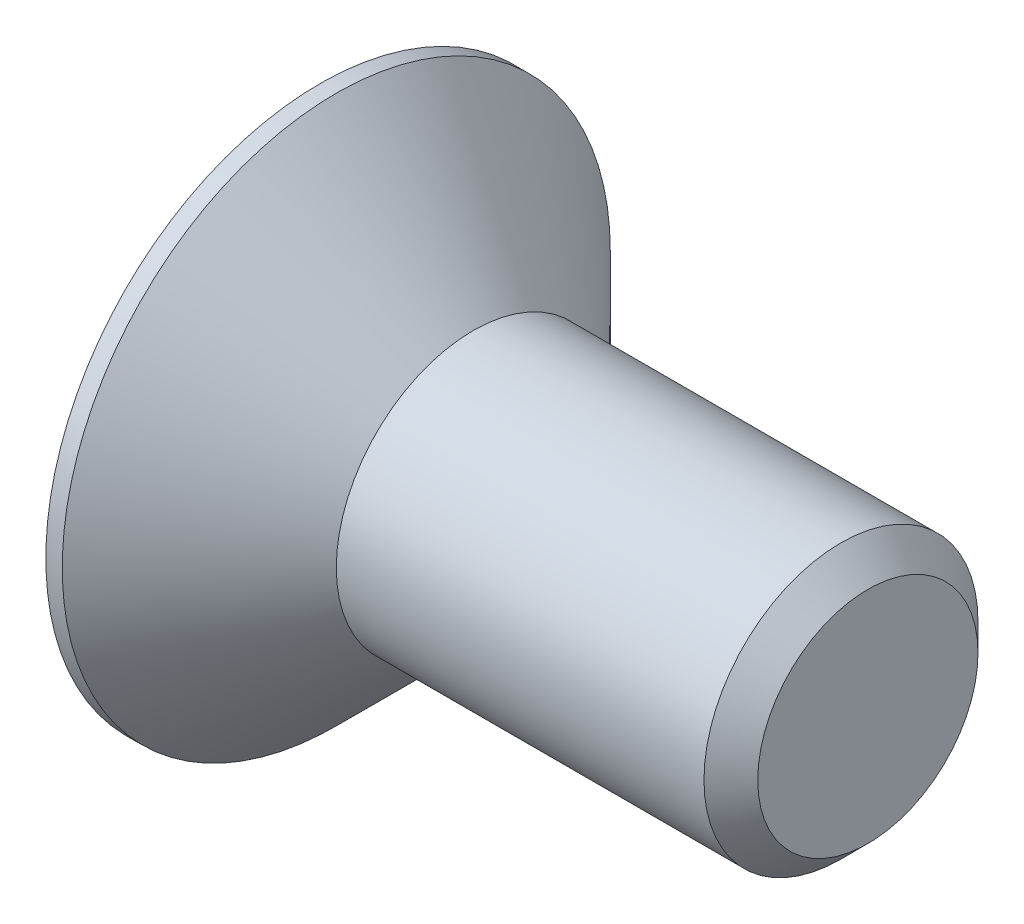
ISO-10303-21;
HEADER;
FILE_DESCRIPTION(('STEP AP214'),'2;1');
FILE_NAME('part.step','',(''),(''),'','','');
FILE_SCHEMA(('AUTOMOTIVE_DESIGN { 1 0 10303 214 1 1 1 1 }'));
ENDSEC;
DATA;
#1=APPLICATION_CONTEXT('core data for automotive mechanical design processes');
#2=APPLICATION_PROTOCOL_DEFINITION('international standard','automotive_design',2000,#1);
#3=PRODUCT_CONTEXT('',#1,'mechanical');
#4=PRODUCT('Part','Part','',(#3));
#5=PRODUCT_RELATED_PRODUCT_CATEGORY('part','',(#4));
#6=PRODUCT_DEFINITION_FORMATION('','',#4);
#7=PRODUCT_DEFINITION_CONTEXT('part definition',#1,'design');
#8=PRODUCT_DEFINITION('design','',#6,#7);
#9=PRODUCT_DEFINITION_SHAPE('','',#8);
#10=(LENGTH_UNIT() NAMED_UNIT(*) SI_UNIT(.MILLI.,.METRE.));
#11=(NAMED_UNIT(*) PLANE_ANGLE_UNIT() SI_UNIT($,.RADIAN.));
#12=(NAMED_UNIT(*) SI_UNIT($,.STERADIAN.) SOLID_ANGLE_UNIT());
#13=UNCERTAINTY_MEASURE_WITH_UNIT(LENGTH_MEASURE(1.E-05),#10,'distance_accuracy_value','');
#14=(GEOMETRIC_REPRESENTATION_CONTEXT(3) GLOBAL_UNCERTAINTY_ASSIGNED_CONTEXT((#13)) GLOBAL_UNIT_ASSIGNED_CONTEXT((#10,
#11,#12)) REPRESENTATION_CONTEXT('',''));
#15=CARTESIAN_POINT('',(0.,0.,0.));
#16=DIRECTION('',(0.,0.,1.));
#17=DIRECTION('',(1.,0.,0.));
#18=AXIS2_PLACEMENT_3D('',#15,#16,#17);
#19=CARTESIAN_POINT('',(-2.8,0.,0.));
#20=DIRECTION('',(1.,0.,0.));
#21=DIRECTION('',(0.,0.,-1.));
#22=AXIS2_PLACEMENT_3D('',#19,#20,#21);
#23=PLANE('',#22);
#24=CARTESIAN_POINT('',(-2.8,0.,0.));
#25=DIRECTION('',(1.,0.,0.));
#26=DIRECTION('',(0.,0.,-1.));
#27=AXIS2_PLACEMENT_3D('',#24,#25,#26);
#28=CIRCLE('',#27,5.);
#29=CARTESIAN_POINT('',(-2.8,0.,-5.));
#30=VERTEX_POINT('',#29);
#31=EDGE_CURVE('E11',#30,#30,#28,.T.);
#32=ORIENTED_EDGE('',*,*,#31,.F.);
#33=EDGE_LOOP('',(#32));
#34=FACE_BOUND('',#33,.T.);
#35=DIRECTION('',(0.,0.5,-0.866025403784439));
#36=VECTOR('',#35,1.);
#37=CARTESIAN_POINT('',(-2.8,-1.73205080756888,0.));
#38=LINE('',#37,#36);
#39=CARTESIAN_POINT('',(-2.8,-1.73205080756888,0.));
#40=VERTEX_POINT('',#39);
#41=CARTESIAN_POINT('',(-2.8,-0.866025403784439,-1.5));
#42=VERTEX_POINT('',#41);
#43=EDGE_CURVE('E149',#40,#42,#38,.T.);
#44=ORIENTED_EDGE('',*,*,#43,.T.);
#45=DIRECTION('',(0.,1.,0.));
#46=VECTOR('',#45,1.);
#47=CARTESIAN_POINT('',(-2.8,-0.866025403784439,-1.5));
#48=LINE('',#47,#46);
#49=CARTESIAN_POINT('',(-2.8,0.866025403784438,-1.5));
#50=VERTEX_POINT('',#49);
#51=EDGE_CURVE('E151',#42,#50,#48,.T.);
#52=ORIENTED_EDGE('',*,*,#51,.T.);
#53=DIRECTION('',(0.,0.5,0.866025403784439));
#54=VECTOR('',#53,1.);
#55=CARTESIAN_POINT('',(-2.8,0.866025403784439,-1.5));
#56=LINE('',#55,#54);
#57=CARTESIAN_POINT('',(-2.8,1.73205080756888,0.));
#58=VERTEX_POINT('',#57);
#59=EDGE_CURVE('E154',#50,#58,#56,.T.);
#60=ORIENTED_EDGE('',*,*,#59,.T.);
#61=DIRECTION('',(0.,-0.5,0.866025403784439));
#62=VECTOR('',#61,1.);
#63=CARTESIAN_POINT('',(-2.8,1.73205080756888,0.));
#64=LINE('',#63,#62);
#65=CARTESIAN_POINT('',(-2.8,0.866025403784439,1.5));
#66=VERTEX_POINT('',#65);
#67=EDGE_CURVE('E99',#58,#66,#64,.T.);
#68=ORIENTED_EDGE('',*,*,#67,.T.);
#69=DIRECTION('',(0.,-1.,0.));
#70=VECTOR('',#69,1.);
#71=CARTESIAN_POINT('',(-2.8,0.866025403784439,1.5));
#72=LINE('',#71,#70);
#73=CARTESIAN_POINT('',(-2.8,-0.866025403784439,1.5));
#74=VERTEX_POINT('',#73);
#75=EDGE_CURVE('E156',#66,#74,#72,.T.);
#76=ORIENTED_EDGE('',*,*,#75,.T.);
#77=DIRECTION('',(0.,-0.5,-0.866025403784439));
#78=VECTOR('',#77,1.);
#79=CARTESIAN_POINT('',(-2.8,-0.866025403784439,1.5));
#80=LINE('',#79,#78);
#81=EDGE_CURVE('E114',#74,#40,#80,.T.);
#82=ORIENTED_EDGE('',*,*,#81,.T.);
#83=EDGE_LOOP('',(#44,#52,#60,#68,#76,#82));
#84=FACE_BOUND('',#83,.T.);
#85=ADVANCED_FACE('F16',(#34,#84),#23,.F.);
#86=CARTESIAN_POINT('',(7.2,0.,0.));
#87=DIRECTION('',(1.,0.,0.));
#88=DIRECTION('',(0.,0.,-1.));
#89=AXIS2_PLACEMENT_3D('',#86,#87,#88);
#90=CYLINDRICAL_SURFACE('',#89,5.);
#91=CARTESIAN_POINT('',(-2.5,0.,0.));
#92=DIRECTION('',(1.,0.,0.));
#93=DIRECTION('',(0.,0.,-1.));
#94=AXIS2_PLACEMENT_3D('',#91,#92,#93);
#95=CIRCLE('',#94,5.);
#96=CARTESIAN_POINT('',(-2.5,0.,-5.));
#97=VERTEX_POINT('',#96);
#98=EDGE_CURVE('E23',#97,#97,#95,.T.);
#99=ORIENTED_EDGE('',*,*,#98,.F.);
#100=EDGE_LOOP('',(#99));
#101=FACE_BOUND('',#100,.T.);
#102=ORIENTED_EDGE('',*,*,#31,.T.);
#103=EDGE_LOOP('',(#102));
#104=FACE_BOUND('',#103,.T.);
#105=ADVANCED_FACE('F140',(#101,#104),#90,.T.);
#106=CARTESIAN_POINT('',(-2.5,0.,0.));
#107=DIRECTION('',(-1.,0.,0.));
#108=DIRECTION('',(0.,0.,1.));
#109=AXIS2_PLACEMENT_3D('',#106,#107,#108);
#110=CONICAL_SURFACE('',#109,5.,0.785398163397448);
#111=CARTESIAN_POINT('',(0.,0.,0.));
#112=DIRECTION('',(1.,0.,0.));
#113=DIRECTION('',(0.,0.,-1.));
#114=AXIS2_PLACEMENT_3D('',#111,#112,#113);
#115=CIRCLE('',#114,2.5);
#116=CARTESIAN_POINT('',(0.,0.,-2.5));
#117=VERTEX_POINT('',#116);
#118=EDGE_CURVE('E133',#117,#117,#115,.T.);
#119=ORIENTED_EDGE('',*,*,#118,.F.);
#120=EDGE_LOOP('',(#119));
#121=FACE_BOUND('',#120,.T.);
#122=ORIENTED_EDGE('',*,*,#98,.T.);
#123=EDGE_LOOP('',(#122));
#124=FACE_BOUND('',#123,.T.);
#125=ADVANCED_FACE('F138',(#121,#124),#110,.T.);
#126=CARTESIAN_POINT('',(7.2,0.,0.));
#127=DIRECTION('',(1.,0.,0.));
#128=DIRECTION('',(0.,0.,-1.));
#129=AXIS2_PLACEMENT_3D('',#126,#127,#128);
#130=CYLINDRICAL_SURFACE('',#129,2.5);
#131=CARTESIAN_POINT('',(6.7095,0.,0.));
#132=DIRECTION('',(1.,0.,0.));
#133=DIRECTION('',(0.,0.,-1.));
#134=AXIS2_PLACEMENT_3D('',#131,#132,#133);
#135=CIRCLE('',#134,2.5);
#136=CARTESIAN_POINT('',(6.7095,0.,-2.5));
#137=VERTEX_POINT('',#136);
#138=EDGE_CURVE('E130',#137,#137,#135,.T.);
#139=ORIENTED_EDGE('',*,*,#138,.F.);
#140=EDGE_LOOP('',(#139));
#141=FACE_BOUND('',#140,.T.);
#142=ORIENTED_EDGE('',*,*,#118,.T.);
#143=EDGE_LOOP('',(#142));
#144=FACE_BOUND('',#143,.T.);
#145=ADVANCED_FACE('F243',(#141,#144),#130,.T.);
#146=CARTESIAN_POINT('',(6.7095,0.,0.));
#147=DIRECTION('',(-1.,0.,0.));
#148=DIRECTION('',(0.,0.,1.));
#149=AXIS2_PLACEMENT_3D('',#146,#147,#148);
#150=CONICAL_SURFACE('',#149,2.5,0.785398163397448);
#151=CARTESIAN_POINT('',(7.2,0.,0.));
#152=DIRECTION('',(1.,0.,0.));
#153=DIRECTION('',(0.,0.,-1.));
#154=AXIS2_PLACEMENT_3D('',#151,#152,#153);
#155=CIRCLE('',#154,2.0095);
#156=CARTESIAN_POINT('',(7.2,0.,-2.0095));
#157=VERTEX_POINT('',#156);
#158=EDGE_CURVE('E126',#157,#157,#155,.T.);
#159=ORIENTED_EDGE('',*,*,#158,.F.);
#160=EDGE_LOOP('',(#159));
#161=FACE_BOUND('',#160,.T.);
#162=ORIENTED_EDGE('',*,*,#138,.T.);
#163=EDGE_LOOP('',(#162));
#164=FACE_BOUND('',#163,.T.);
#165=ADVANCED_FACE('F239',(#161,#164),#150,.T.);
#166=CARTESIAN_POINT('',(7.2,2.0095,0.));
#167=DIRECTION('',(-1.,0.,0.));
#168=DIRECTION('',(0.,0.,1.));
#169=AXIS2_PLACEMENT_3D('',#166,#167,#168);
#170=PLANE('',#169);
#171=ORIENTED_EDGE('',*,*,#158,.T.);
#172=EDGE_LOOP('',(#171));
#173=FACE_BOUND('',#172,.T.);
#174=ADVANCED_FACE('F234',(#173),#170,.F.);
#175=CARTESIAN_POINT('',(-1.4,0.866025403784439,1.5));
#176=DIRECTION('',(0.,0.,-1.));
#177=DIRECTION('',(-1.,0.,0.));
#178=AXIS2_PLACEMENT_3D('',#175,#176,#177);
#179=PLANE('',#178);
#180=ORIENTED_EDGE('',*,*,#75,.F.);
#181=DIRECTION('',(-1.,0.,0.));
#182=VECTOR('',#181,1.);
#183=CARTESIAN_POINT('',(-1.4,0.866025403784439,1.5));
#184=LINE('',#183,#182);
#185=CARTESIAN_POINT('',(-1.4,0.866025403784439,1.5));
#186=VERTEX_POINT('',#185);
#187=EDGE_CURVE('E163',#186,#66,#184,.T.);
#188=ORIENTED_EDGE('',*,*,#187,.F.);
#189=DIRECTION('',(0.,-1.,0.));
#190=VECTOR('',#189,1.);
#191=CARTESIAN_POINT('',(-1.4,0.866025403784439,1.5));
#192=LINE('',#191,#190);
#193=CARTESIAN_POINT('',(-1.4,0.,1.5));
#194=VERTEX_POINT('',#193);
#195=EDGE_CURVE('E96',#186,#194,#192,.T.);
#196=ORIENTED_EDGE('',*,*,#195,.T.);
#197=CARTESIAN_POINT('',(-1.4,-0.866025403784439,1.5));
#198=VERTEX_POINT('',#197);
#199=EDGE_CURVE('E88',#194,#198,#192,.T.);
#200=ORIENTED_EDGE('',*,*,#199,.T.);
#201=DIRECTION('',(-1.,0.,0.));
#202=VECTOR('',#201,1.);
#203=CARTESIAN_POINT('',(-1.4,-0.866025403784439,1.5));
#204=LINE('',#203,#202);
#205=EDGE_CURVE('E92',#198,#74,#204,.T.);
#206=ORIENTED_EDGE('',*,*,#205,.T.);
#207=EDGE_LOOP('',(#180,#188,#196,#200,#206));
#208=FACE_BOUND('',#207,.T.);
#209=ADVANCED_FACE('F90',(#208),#179,.T.);
#210=CARTESIAN_POINT('',(-1.4,-0.866025403784439,1.5));
#211=DIRECTION('',(0.,0.866025403784439,-0.5));
#212=DIRECTION('',(0.,0.5,0.866025403784439));
#213=AXIS2_PLACEMENT_3D('',#210,#211,#212);
#214=PLANE('',#213);
#215=ORIENTED_EDGE('',*,*,#81,.F.);
#216=ORIENTED_EDGE('',*,*,#205,.F.);
#217=DIRECTION('',(0.,-0.5,-0.866025403784439));
#218=VECTOR('',#217,1.);
#219=CARTESIAN_POINT('',(-1.4,-0.866025403784439,1.5));
#220=LINE('',#219,#218);
#221=CARTESIAN_POINT('',(-1.4,-1.29903810567666,0.75));
#222=VERTEX_POINT('',#221);
#223=EDGE_CURVE('E102',#198,#222,#220,.T.);
#224=ORIENTED_EDGE('',*,*,#223,.T.);
#225=CARTESIAN_POINT('',(-1.4,-1.73205080756888,0.));
#226=VERTEX_POINT('',#225);
#227=EDGE_CURVE('E109',#222,#226,#220,.T.);
#228=ORIENTED_EDGE('',*,*,#227,.T.);
#229=DIRECTION('',(-1.,0.,0.));
#230=VECTOR('',#229,1.);
#231=CARTESIAN_POINT('',(-1.4,-1.73205080756888,0.));
#232=LINE('',#231,#230);
#233=EDGE_CURVE('E116',#226,#40,#232,.T.);
#234=ORIENTED_EDGE('',*,*,#233,.T.);
#235=EDGE_LOOP('',(#215,#216,#224,#228,#234));
#236=FACE_BOUND('',#235,.T.);
#237=ADVANCED_FACE('F111',(#236),#214,.T.);
#238=CARTESIAN_POINT('',(-1.4,-1.73205080756888,0.));
#239=DIRECTION('',(0.,0.866025403784439,0.5));
#240=DIRECTION('',(0.,-0.5,0.866025403784439));
#241=AXIS2_PLACEMENT_3D('',#238,#239,#240);
#242=PLANE('',#241);
#243=ORIENTED_EDGE('',*,*,#43,.F.);
#244=ORIENTED_EDGE('',*,*,#233,.F.);
#245=DIRECTION('',(0.,0.5,-0.866025403784439));
#246=VECTOR('',#245,1.);
#247=CARTESIAN_POINT('',(-1.4,-1.73205080756888,0.));
#248=LINE('',#247,#246);
#249=CARTESIAN_POINT('',(-1.4,-1.29903810567666,-0.75));
#250=VERTEX_POINT('',#249);
#251=EDGE_CURVE('E30',#226,#250,#248,.T.);
#252=ORIENTED_EDGE('',*,*,#251,.T.);
#253=CARTESIAN_POINT('',(-1.4,-0.866025403784439,-1.5));
#254=VERTEX_POINT('',#253);
#255=EDGE_CURVE('E108',#250,#254,#248,.T.);
#256=ORIENTED_EDGE('',*,*,#255,.T.);
#257=DIRECTION('',(-1.,0.,0.));
#258=VECTOR('',#257,1.);
#259=CARTESIAN_POINT('',(-1.4,-0.866025403784439,-1.5));
#260=LINE('',#259,#258);
#261=EDGE_CURVE('E122',#254,#42,#260,.T.);
#262=ORIENTED_EDGE('',*,*,#261,.T.);
#263=EDGE_LOOP('',(#243,#244,#252,#256,#262));
#264=FACE_BOUND('',#263,.T.);
#265=ADVANCED_FACE('F173',(#264),#242,.T.);
#266=CARTESIAN_POINT('',(-1.4,-0.866025403784439,-1.5));
#267=DIRECTION('',(0.,0.,1.));
#268=DIRECTION('',(1.,0.,0.));
#269=AXIS2_PLACEMENT_3D('',#266,#267,#268);
#270=PLANE('',#269);
#271=ORIENTED_EDGE('',*,*,#51,.F.);
#272=ORIENTED_EDGE('',*,*,#261,.F.);
#273=DIRECTION('',(0.,1.,0.));
#274=VECTOR('',#273,1.);
#275=CARTESIAN_POINT('',(-1.4,-0.866025403784439,-1.5));
#276=LINE('',#275,#274);
#277=CARTESIAN_POINT('',(-1.4,0.,-1.5));
#278=VERTEX_POINT('',#277);
#279=EDGE_CURVE('E178',#254,#278,#276,.T.);
#280=ORIENTED_EDGE('',*,*,#279,.T.);
#281=CARTESIAN_POINT('',(-1.4,0.866025403784438,-1.5));
#282=VERTEX_POINT('',#281);
#283=EDGE_CURVE('E186',#278,#282,#276,.T.);
#284=ORIENTED_EDGE('',*,*,#283,.T.);
#285=DIRECTION('',(-1.,0.,0.));
#286=VECTOR('',#285,1.);
#287=CARTESIAN_POINT('',(-1.4,0.866025403784438,-1.5));
#288=LINE('',#287,#286);
#289=EDGE_CURVE('E170',#282,#50,#288,.T.);
#290=ORIENTED_EDGE('',*,*,#289,.T.);
#291=EDGE_LOOP('',(#271,#272,#280,#284,#290));
#292=FACE_BOUND('',#291,.T.);
#293=ADVANCED_FACE('F177',(#292),#270,.T.);
#294=CARTESIAN_POINT('',(-1.4,0.866025403784439,-1.5));
#295=DIRECTION('',(0.,-0.866025403784439,0.5));
#296=DIRECTION('',(0.,-0.5,-0.866025403784439));
#297=AXIS2_PLACEMENT_3D('',#294,#295,#296);
#298=PLANE('',#297);
#299=ORIENTED_EDGE('',*,*,#59,.F.);
#300=ORIENTED_EDGE('',*,*,#289,.F.);
#301=DIRECTION('',(0.,0.5,0.866025403784439));
#302=VECTOR('',#301,1.);
#303=CARTESIAN_POINT('',(-1.4,0.866025403784439,-1.5));
#304=LINE('',#303,#302);
#305=CARTESIAN_POINT('',(-1.4,1.29903810567666,-0.75));
#306=VERTEX_POINT('',#305);
#307=EDGE_CURVE('E188',#282,#306,#304,.T.);
#308=ORIENTED_EDGE('',*,*,#307,.T.);
#309=CARTESIAN_POINT('',(-1.4,1.73205080756888,0.));
#310=VERTEX_POINT('',#309);
#311=EDGE_CURVE('E185',#306,#310,#304,.T.);
#312=ORIENTED_EDGE('',*,*,#311,.T.);
#313=DIRECTION('',(-1.,0.,0.));
#314=VECTOR('',#313,1.);
#315=CARTESIAN_POINT('',(-1.4,1.73205080756888,0.));
#316=LINE('',#315,#314);
#317=EDGE_CURVE('E166',#310,#58,#316,.T.);
#318=ORIENTED_EDGE('',*,*,#317,.T.);
#319=EDGE_LOOP('',(#299,#300,#308,#312,#318));
#320=FACE_BOUND('',#319,.T.);
#321=ADVANCED_FACE('F216',(#320),#298,.T.);
#322=CARTESIAN_POINT('',(-1.4,1.73205080756888,0.));
#323=DIRECTION('',(0.,-0.866025403784439,-0.5));
#324=DIRECTION('',(0.,0.5,-0.866025403784439));
#325=AXIS2_PLACEMENT_3D('',#322,#323,#324);
#326=PLANE('',#325);
#327=ORIENTED_EDGE('',*,*,#67,.F.);
#328=ORIENTED_EDGE('',*,*,#317,.F.);
#329=DIRECTION('',(0.,-0.5,0.866025403784439));
#330=VECTOR('',#329,1.);
#331=CARTESIAN_POINT('',(-1.4,1.73205080756888,0.));
#332=LINE('',#331,#330);
#333=CARTESIAN_POINT('',(-1.4,1.29903810567666,0.75));
#334=VERTEX_POINT('',#333);
#335=EDGE_CURVE('E167',#310,#334,#332,.T.);
#336=ORIENTED_EDGE('',*,*,#335,.T.);
#337=EDGE_CURVE('E193',#334,#186,#332,.T.);
#338=ORIENTED_EDGE('',*,*,#337,.T.);
#339=ORIENTED_EDGE('',*,*,#187,.T.);
#340=EDGE_LOOP('',(#327,#328,#336,#338,#339));
#341=FACE_BOUND('',#340,.T.);
#342=ADVANCED_FACE('F196',(#341),#326,.T.);
#343=CARTESIAN_POINT('',(-1.4,0.,0.));
#344=DIRECTION('',(1.,0.,0.));
#345=DIRECTION('',(0.,0.,-1.));
#346=AXIS2_PLACEMENT_3D('',#343,#344,#345);
#347=PLANE('',#346);
#348=CARTESIAN_POINT('',(-1.4,0.,0.));
#349=DIRECTION('',(1.,0.,0.));
#350=DIRECTION('',(0.,0.,-1.));
#351=AXIS2_PLACEMENT_3D('',#348,#349,#350);
#352=CIRCLE('',#351,1.5);
#353=EDGE_CURVE('E115',#278,#306,#352,.T.);
#354=ORIENTED_EDGE('',*,*,#353,.T.);
#355=ORIENTED_EDGE('',*,*,#307,.F.);
#356=ORIENTED_EDGE('',*,*,#283,.F.);
#357=EDGE_LOOP('',(#354,#355,#356));
#358=FACE_BOUND('',#357,.T.);
#359=ADVANCED_FACE('F211',(#358),#347,.F.);
#360=ORIENTED_EDGE('',*,*,#311,.F.);
#361=EDGE_CURVE('E121',#306,#334,#352,.T.);
#362=ORIENTED_EDGE('',*,*,#361,.T.);
#363=ORIENTED_EDGE('',*,*,#335,.F.);
#364=EDGE_LOOP('',(#360,#362,#363));
#365=FACE_BOUND('',#364,.T.);
#366=ADVANCED_FACE('F213',(#365),#347,.F.);
#367=EDGE_CURVE('E127',#334,#194,#352,.T.);
#368=ORIENTED_EDGE('',*,*,#367,.T.);
#369=ORIENTED_EDGE('',*,*,#195,.F.);
#370=ORIENTED_EDGE('',*,*,#337,.F.);
#371=EDGE_LOOP('',(#368,#369,#370));
#372=FACE_BOUND('',#371,.T.);
#373=ADVANCED_FACE('F202',(#372),#347,.F.);
#374=EDGE_CURVE('E104',#194,#222,#352,.T.);
#375=ORIENTED_EDGE('',*,*,#374,.T.);
#376=ORIENTED_EDGE('',*,*,#223,.F.);
#377=ORIENTED_EDGE('',*,*,#199,.F.);
#378=EDGE_LOOP('',(#375,#376,#377));
#379=FACE_BOUND('',#378,.T.);
#380=ADVANCED_FACE('F103',(#379),#347,.F.);
#381=EDGE_CURVE('E205',#222,#250,#352,.T.);
#382=ORIENTED_EDGE('',*,*,#381,.T.);
#383=ORIENTED_EDGE('',*,*,#251,.F.);
#384=ORIENTED_EDGE('',*,*,#227,.F.);
#385=EDGE_LOOP('',(#382,#383,#384));
#386=FACE_BOUND('',#385,.T.);
#387=ADVANCED_FACE('F204',(#386),#347,.F.);
#388=EDGE_CURVE('E119',#250,#278,#352,.T.);
#389=ORIENTED_EDGE('',*,*,#388,.T.);
#390=ORIENTED_EDGE('',*,*,#279,.F.);
#391=ORIENTED_EDGE('',*,*,#255,.F.);
#392=EDGE_LOOP('',(#389,#390,#391));
#393=FACE_BOUND('',#392,.T.);
#394=ADVANCED_FACE('F181',(#393),#347,.F.);
#395=CARTESIAN_POINT('',(-1.4,0.,0.));
#396=DIRECTION('',(-1.,0.,0.));
#397=DIRECTION('',(0.,0.,1.));
#398=AXIS2_PLACEMENT_3D('',#395,#396,#397);
#399=CONICAL_SURFACE('',#398,1.5,1.30899693899575);
#400=CARTESIAN_POINT('',(-0.998076211353317,0.,0.));
#401=VERTEX_POINT('',#400);
#402=VERTEX_LOOP('',#401);
#403=FACE_BOUND('',#402,.T.);
#404=ORIENTED_EDGE('',*,*,#361,.F.);
#405=ORIENTED_EDGE('',*,*,#353,.F.);
#406=ORIENTED_EDGE('',*,*,#388,.F.);
#407=ORIENTED_EDGE('',*,*,#381,.F.);
#408=ORIENTED_EDGE('',*,*,#374,.F.);
#409=ORIENTED_EDGE('',*,*,#367,.F.);
#410=EDGE_LOOP('',(#404,#405,#406,#407,#408,#409));
#411=FACE_BOUND('',#410,.T.);
#412=ADVANCED_FACE('F207',(#403,#411),#399,.F.);
#413=CLOSED_SHELL('',(#85,#105,#125,#145,#165,#174,#209,#237,#265,#293,#321,#342,#359,#366,#373,
#380,#387,#394,#412));
#414=MANIFOLD_SOLID_BREP('B1',#413);
#415=ADVANCED_BREP_SHAPE_REPRESENTATION('',(#18,#414),#14);
#416=SHAPE_DEFINITION_REPRESENTATION(#9,#415);
ENDSEC;
END-ISO-10303-21;
